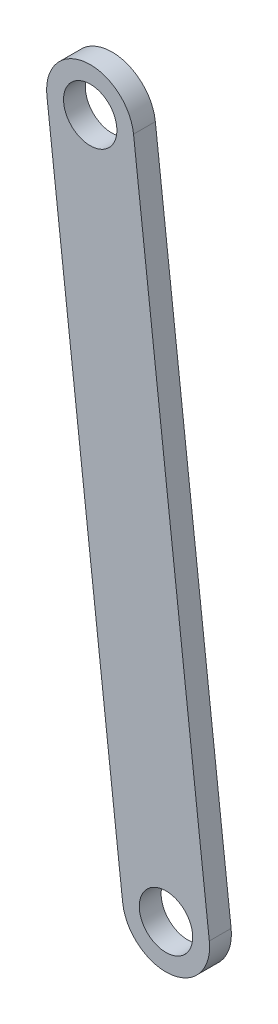
ISO-10303-21;
HEADER;
FILE_DESCRIPTION(('STEP AP214'),'2;1');
FILE_NAME('part.step','',(''),(''),'','','');
FILE_SCHEMA(('AUTOMOTIVE_DESIGN { 1 0 10303 214 1 1 1 1 }'));
ENDSEC;
DATA;
#1=APPLICATION_CONTEXT('core data for automotive mechanical design processes');
#2=APPLICATION_PROTOCOL_DEFINITION('international standard','automotive_design',2000,#1);
#3=PRODUCT_CONTEXT('',#1,'mechanical');
#4=PRODUCT('Part','Part','',(#3));
#5=PRODUCT_RELATED_PRODUCT_CATEGORY('part','',(#4));
#6=PRODUCT_DEFINITION_FORMATION('','',#4);
#7=PRODUCT_DEFINITION_CONTEXT('part definition',#1,'design');
#8=PRODUCT_DEFINITION('design','',#6,#7);
#9=PRODUCT_DEFINITION_SHAPE('','',#8);
#10=(LENGTH_UNIT() NAMED_UNIT(*) SI_UNIT(.MILLI.,.METRE.));
#11=(NAMED_UNIT(*) PLANE_ANGLE_UNIT() SI_UNIT($,.RADIAN.));
#12=(NAMED_UNIT(*) SI_UNIT($,.STERADIAN.) SOLID_ANGLE_UNIT());
#13=UNCERTAINTY_MEASURE_WITH_UNIT(LENGTH_MEASURE(1.E-05),#10,'distance_accuracy_value','');
#14=(GEOMETRIC_REPRESENTATION_CONTEXT(3) GLOBAL_UNCERTAINTY_ASSIGNED_CONTEXT((#13)) GLOBAL_UNIT_ASSIGNED_CONTEXT((#10,
#11,#12)) REPRESENTATION_CONTEXT('',''));
#15=CARTESIAN_POINT('',(0.,0.,0.));
#16=DIRECTION('',(0.,0.,1.));
#17=DIRECTION('',(1.,0.,0.));
#18=AXIS2_PLACEMENT_3D('',#15,#16,#17);
#19=CARTESIAN_POINT('',(588.770678720661,67.5045379759911,6.35));
#20=DIRECTION('',(0.99349140197591,0.113907129715137,0.));
#21=DIRECTION('',(-0.113907129715137,0.99349140197591,0.));
#22=AXIS2_PLACEMENT_3D('',#19,#20,#21);
#23=PLANE('',#22);
#24=DIRECTION('',(0.113907129715137,-0.99349140197591,0.));
#25=VECTOR('',#24,1.);
#26=CARTESIAN_POINT('',(588.770678720661,67.5045379759911,0.));
#27=LINE('',#26,#25);
#28=CARTESIAN_POINT('',(558.398266039006,332.410965975276,0.));
#29=VERTEX_POINT('',#28);
#30=CARTESIAN_POINT('',(580.459229386585,139.996518697592,0.));
#31=VERTEX_POINT('',#30);
#32=EDGE_CURVE('E108',#29,#31,#27,.T.);
#33=ORIENTED_EDGE('',*,*,#32,.T.);
#34=DIRECTION('',(0.,0.,-1.));
#35=VECTOR('',#34,1.);
#36=CARTESIAN_POINT('',(580.459229386585,139.996518697592,6.35));
#37=LINE('',#36,#35);
#38=CARTESIAN_POINT('',(580.459229386585,139.996518697592,6.35));
#39=VERTEX_POINT('',#38);
#40=EDGE_CURVE('E11',#39,#31,#37,.T.);
#41=ORIENTED_EDGE('',*,*,#40,.F.);
#42=DIRECTION('',(0.113907129715137,-0.99349140197591,0.));
#43=VECTOR('',#42,1.);
#44=CARTESIAN_POINT('',(588.770678720661,67.5045379759911,6.35));
#45=LINE('',#44,#43);
#46=CARTESIAN_POINT('',(558.398266039006,332.410965975276,6.35));
#47=VERTEX_POINT('',#46);
#48=EDGE_CURVE('E87',#47,#39,#45,.T.);
#49=ORIENTED_EDGE('',*,*,#48,.F.);
#50=DIRECTION('',(0.,0.,-1.));
#51=VECTOR('',#50,1.);
#52=CARTESIAN_POINT('',(558.398266039006,332.410965975276,6.35));
#53=LINE('',#52,#51);
#54=EDGE_CURVE('E107',#47,#29,#53,.T.);
#55=ORIENTED_EDGE('',*,*,#54,.T.);
#56=EDGE_LOOP('',(#33,#41,#49,#55));
#57=FACE_BOUND('',#56,.T.);
#58=ADVANCED_FACE('F39',(#57),#23,.F.);
#59=CARTESIAN_POINT('',(593.076570191679,141.443139244974,6.35));
#60=DIRECTION('',(0.,0.,-1.));
#61=DIRECTION('',(-1.,0.,0.));
#62=AXIS2_PLACEMENT_3D('',#59,#60,#61);
#63=CYLINDRICAL_SURFACE('',#62,12.7);
#64=CARTESIAN_POINT('',(593.076570191679,141.443139244974,0.));
#65=DIRECTION('',(0.,0.,1.));
#66=DIRECTION('',(1.,0.,0.));
#67=AXIS2_PLACEMENT_3D('',#64,#65,#66);
#68=CIRCLE('',#67,12.7);
#69=CARTESIAN_POINT('',(605.693910996773,142.889759792356,0.));
#70=VERTEX_POINT('',#69);
#71=EDGE_CURVE('E92',#31,#70,#68,.T.);
#72=ORIENTED_EDGE('',*,*,#71,.T.);
#73=DIRECTION('',(0.,0.,-1.));
#74=VECTOR('',#73,1.);
#75=CARTESIAN_POINT('',(605.693910996773,142.889759792356,6.35));
#76=LINE('',#75,#74);
#77=CARTESIAN_POINT('',(605.693910996773,142.889759792356,6.35));
#78=VERTEX_POINT('',#77);
#79=EDGE_CURVE('E47',#78,#70,#76,.T.);
#80=ORIENTED_EDGE('',*,*,#79,.F.);
#81=CARTESIAN_POINT('',(593.076570191679,141.443139244974,6.35));
#82=DIRECTION('',(0.,0.,1.));
#83=DIRECTION('',(1.,0.,0.));
#84=AXIS2_PLACEMENT_3D('',#81,#82,#83);
#85=CIRCLE('',#84,12.7);
#86=EDGE_CURVE('E81',#39,#78,#85,.T.);
#87=ORIENTED_EDGE('',*,*,#86,.F.);
#88=ORIENTED_EDGE('',*,*,#40,.T.);
#89=EDGE_LOOP('',(#72,#80,#87,#88));
#90=FACE_BOUND('',#89,.T.);
#91=ADVANCED_FACE('F91',(#90),#63,.T.);
#92=CARTESIAN_POINT('',(614.005360330849,70.3977790707548,6.35));
#93=DIRECTION('',(0.99349140197591,0.113907129715136,0.));
#94=DIRECTION('',(-0.113907129715136,0.99349140197591,0.));
#95=AXIS2_PLACEMENT_3D('',#92,#93,#94);
#96=PLANE('',#95);
#97=DIRECTION('',(0.113907129715136,-0.99349140197591,0.));
#98=VECTOR('',#97,1.);
#99=CARTESIAN_POINT('',(614.005360330849,70.3977790707548,0.));
#100=LINE('',#99,#98);
#101=CARTESIAN_POINT('',(583.632947649194,335.30420707004,0.));
#102=VERTEX_POINT('',#101);
#103=EDGE_CURVE('E112',#102,#70,#100,.T.);
#104=ORIENTED_EDGE('',*,*,#103,.F.);
#105=DIRECTION('',(0.,0.,-1.));
#106=VECTOR('',#105,1.);
#107=CARTESIAN_POINT('',(583.632947649194,335.30420707004,6.35));
#108=LINE('',#107,#106);
#109=CARTESIAN_POINT('',(583.632947649194,335.30420707004,6.35));
#110=VERTEX_POINT('',#109);
#111=EDGE_CURVE('E71',#110,#102,#108,.T.);
#112=ORIENTED_EDGE('',*,*,#111,.F.);
#113=DIRECTION('',(0.113907129715136,-0.99349140197591,0.));
#114=VECTOR('',#113,1.);
#115=CARTESIAN_POINT('',(614.005360330849,70.3977790707548,6.35));
#116=LINE('',#115,#114);
#117=EDGE_CURVE('E85',#110,#78,#116,.T.);
#118=ORIENTED_EDGE('',*,*,#117,.T.);
#119=ORIENTED_EDGE('',*,*,#79,.T.);
#120=EDGE_LOOP('',(#104,#112,#118,#119));
#121=FACE_BOUND('',#120,.T.);
#122=ADVANCED_FACE('F96',(#121),#96,.T.);
#123=CARTESIAN_POINT('',(571.0156068441,333.857586522658,6.35));
#124=DIRECTION('',(0.,0.,-1.));
#125=DIRECTION('',(-1.,0.,0.));
#126=AXIS2_PLACEMENT_3D('',#123,#124,#125);
#127=CYLINDRICAL_SURFACE('',#126,7.77201899999998);
#128=CARTESIAN_POINT('',(571.0156068441,333.857586522658,6.35));
#129=DIRECTION('',(0.,0.,1.));
#130=DIRECTION('',(1.,0.,0.));
#131=AXIS2_PLACEMENT_3D('',#128,#129,#130);
#132=CIRCLE('',#131,7.77201899999998);
#133=CARTESIAN_POINT('',(578.7876258441,333.857586522658,6.35));
#134=VERTEX_POINT('',#133);
#135=EDGE_CURVE('E98',#134,#134,#132,.T.);
#136=ORIENTED_EDGE('',*,*,#135,.T.);
#137=EDGE_LOOP('',(#136));
#138=FACE_BOUND('',#137,.T.);
#139=CARTESIAN_POINT('',(571.0156068441,333.857586522658,0.));
#140=DIRECTION('',(0.,0.,1.));
#141=DIRECTION('',(1.,0.,0.));
#142=AXIS2_PLACEMENT_3D('',#139,#140,#141);
#143=CIRCLE('',#142,7.77201899999998);
#144=CARTESIAN_POINT('',(578.7876258441,333.857586522658,0.));
#145=VERTEX_POINT('',#144);
#146=EDGE_CURVE('E115',#145,#145,#143,.T.);
#147=ORIENTED_EDGE('',*,*,#146,.F.);
#148=EDGE_LOOP('',(#147));
#149=FACE_BOUND('',#148,.T.);
#150=ADVANCED_FACE('F143',(#138,#149),#127,.F.);
#151=CARTESIAN_POINT('',(571.0156068441,333.857586522658,6.35));
#152=DIRECTION('',(0.,0.,-1.));
#153=DIRECTION('',(-1.,0.,0.));
#154=AXIS2_PLACEMENT_3D('',#151,#152,#153);
#155=CYLINDRICAL_SURFACE('',#154,12.7);
#156=CARTESIAN_POINT('',(571.0156068441,333.857586522658,0.));
#157=DIRECTION('',(0.,0.,1.));
#158=DIRECTION('',(1.,0.,0.));
#159=AXIS2_PLACEMENT_3D('',#156,#157,#158);
#160=CIRCLE('',#159,12.7);
#161=EDGE_CURVE('E74',#102,#29,#160,.T.);
#162=ORIENTED_EDGE('',*,*,#161,.T.);
#163=ORIENTED_EDGE('',*,*,#54,.F.);
#164=CARTESIAN_POINT('',(571.0156068441,333.857586522658,6.35));
#165=DIRECTION('',(0.,0.,1.));
#166=DIRECTION('',(1.,0.,0.));
#167=AXIS2_PLACEMENT_3D('',#164,#165,#166);
#168=CIRCLE('',#167,12.7);
#169=EDGE_CURVE('E55',#110,#47,#168,.T.);
#170=ORIENTED_EDGE('',*,*,#169,.F.);
#171=ORIENTED_EDGE('',*,*,#111,.T.);
#172=EDGE_LOOP('',(#162,#163,#170,#171));
#173=FACE_BOUND('',#172,.T.);
#174=ADVANCED_FACE('F135',(#173),#155,.T.);
#175=CARTESIAN_POINT('',(593.076570191679,141.443139244974,6.35));
#176=DIRECTION('',(0.,0.,-1.));
#177=DIRECTION('',(-1.,0.,0.));
#178=AXIS2_PLACEMENT_3D('',#175,#176,#177);
#179=CYLINDRICAL_SURFACE('',#178,7.77201899999998);
#180=CARTESIAN_POINT('',(593.076570191679,141.443139244974,6.35));
#181=DIRECTION('',(0.,0.,1.));
#182=DIRECTION('',(1.,0.,0.));
#183=AXIS2_PLACEMENT_3D('',#180,#181,#182);
#184=CIRCLE('',#183,7.77201899999998);
#185=CARTESIAN_POINT('',(600.848589191679,141.443139244974,6.35));
#186=VERTEX_POINT('',#185);
#187=EDGE_CURVE('E104',#186,#186,#184,.T.);
#188=ORIENTED_EDGE('',*,*,#187,.T.);
#189=EDGE_LOOP('',(#188));
#190=FACE_BOUND('',#189,.T.);
#191=CARTESIAN_POINT('',(593.076570191679,141.443139244974,0.));
#192=DIRECTION('',(0.,0.,1.));
#193=DIRECTION('',(1.,0.,0.));
#194=AXIS2_PLACEMENT_3D('',#191,#192,#193);
#195=CIRCLE('',#194,7.77201899999998);
#196=CARTESIAN_POINT('',(600.848589191679,141.443139244974,0.));
#197=VERTEX_POINT('',#196);
#198=EDGE_CURVE('E118',#197,#197,#195,.T.);
#199=ORIENTED_EDGE('',*,*,#198,.F.);
#200=EDGE_LOOP('',(#199));
#201=FACE_BOUND('',#200,.T.);
#202=ADVANCED_FACE('F133',(#190,#201),#179,.F.);
#203=CARTESIAN_POINT('',(0.,0.,6.35));
#204=DIRECTION('',(0.,0.,1.));
#205=DIRECTION('',(1.,0.,0.));
#206=AXIS2_PLACEMENT_3D('',#203,#204,#205);
#207=PLANE('',#206);
#208=ORIENTED_EDGE('',*,*,#48,.T.);
#209=ORIENTED_EDGE('',*,*,#86,.T.);
#210=ORIENTED_EDGE('',*,*,#117,.F.);
#211=ORIENTED_EDGE('',*,*,#169,.T.);
#212=EDGE_LOOP('',(#208,#209,#210,#211));
#213=FACE_BOUND('',#212,.T.);
#214=ORIENTED_EDGE('',*,*,#135,.F.);
#215=EDGE_LOOP('',(#214));
#216=FACE_BOUND('',#215,.T.);
#217=ORIENTED_EDGE('',*,*,#187,.F.);
#218=EDGE_LOOP('',(#217));
#219=FACE_BOUND('',#218,.T.);
#220=ADVANCED_FACE('F82',(#213,#216,#219),#207,.T.);
#221=CARTESIAN_POINT('',(0.,0.,0.));
#222=DIRECTION('',(0.,0.,1.));
#223=DIRECTION('',(1.,0.,0.));
#224=AXIS2_PLACEMENT_3D('',#221,#222,#223);
#225=PLANE('',#224);
#226=ORIENTED_EDGE('',*,*,#32,.F.);
#227=ORIENTED_EDGE('',*,*,#161,.F.);
#228=ORIENTED_EDGE('',*,*,#103,.T.);
#229=ORIENTED_EDGE('',*,*,#71,.F.);
#230=EDGE_LOOP('',(#226,#227,#228,#229));
#231=FACE_BOUND('',#230,.T.);
#232=ORIENTED_EDGE('',*,*,#146,.T.);
#233=EDGE_LOOP('',(#232));
#234=FACE_BOUND('',#233,.T.);
#235=ORIENTED_EDGE('',*,*,#198,.T.);
#236=EDGE_LOOP('',(#235));
#237=FACE_BOUND('',#236,.T.);
#238=ADVANCED_FACE('F125',(#231,#234,#237),#225,.F.);
#239=CLOSED_SHELL('',(#58,#91,#122,#150,#174,#202,#220,#238));
#240=MANIFOLD_SOLID_BREP('B2',#239);
#241=ADVANCED_BREP_SHAPE_REPRESENTATION('',(#18,#240),#14);
#242=SHAPE_DEFINITION_REPRESENTATION(#9,#241);
ENDSEC;
END-ISO-10303-21;
